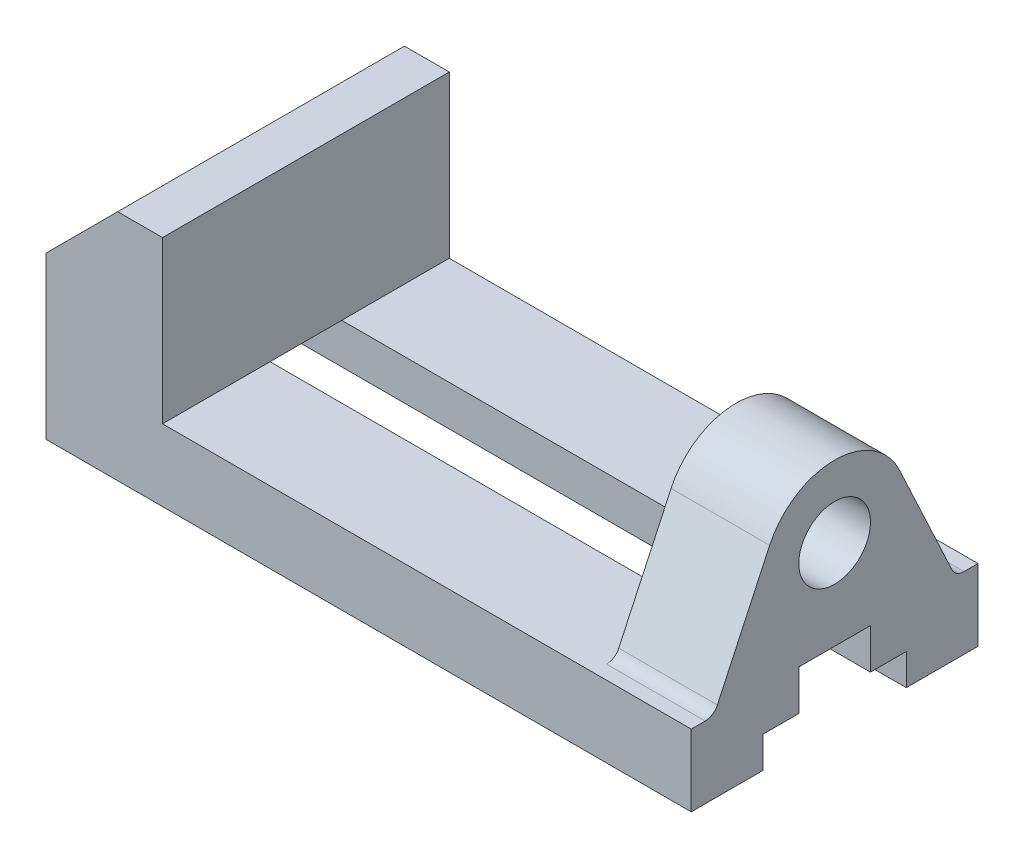
ISO-10303-21;
HEADER;
FILE_DESCRIPTION(('STEP AP214'),'2;1');
FILE_NAME('part.step','',(''),(''),'','','');
FILE_SCHEMA(('AUTOMOTIVE_DESIGN { 1 0 10303 214 1 1 1 1 }'));
ENDSEC;
DATA;
#1=APPLICATION_CONTEXT('core data for automotive mechanical design processes');
#2=APPLICATION_PROTOCOL_DEFINITION('international standard','automotive_design',2000,#1);
#3=PRODUCT_CONTEXT('',#1,'mechanical');
#4=PRODUCT('Part','Part','',(#3));
#5=PRODUCT_RELATED_PRODUCT_CATEGORY('part','',(#4));
#6=PRODUCT_DEFINITION_FORMATION('','',#4);
#7=PRODUCT_DEFINITION_CONTEXT('part definition',#1,'design');
#8=PRODUCT_DEFINITION('design','',#6,#7);
#9=PRODUCT_DEFINITION_SHAPE('','',#8);
#10=(LENGTH_UNIT() NAMED_UNIT(*) SI_UNIT(.MILLI.,.METRE.));
#11=(NAMED_UNIT(*) PLANE_ANGLE_UNIT() SI_UNIT($,.RADIAN.));
#12=(NAMED_UNIT(*) SI_UNIT($,.STERADIAN.) SOLID_ANGLE_UNIT());
#13=UNCERTAINTY_MEASURE_WITH_UNIT(LENGTH_MEASURE(1.E-05),#10,'distance_accuracy_value','');
#14=(GEOMETRIC_REPRESENTATION_CONTEXT(3) GLOBAL_UNCERTAINTY_ASSIGNED_CONTEXT((#13)) GLOBAL_UNIT_ASSIGNED_CONTEXT((#10,
#11,#12)) REPRESENTATION_CONTEXT('',''));
#15=CARTESIAN_POINT('',(0.,0.,0.));
#16=DIRECTION('',(0.,0.,1.));
#17=DIRECTION('',(1.,0.,0.));
#18=AXIS2_PLACEMENT_3D('',#15,#16,#17);
#19=CARTESIAN_POINT('',(26.,16.,32.));
#20=DIRECTION('',(0.,1.,0.));
#21=DIRECTION('',(0.,0.,1.));
#22=AXIS2_PLACEMENT_3D('',#19,#20,#21);
#23=PLANE('',#22);
#24=DIRECTION('',(1.,0.,0.));
#25=VECTOR('',#24,1.);
#26=CARTESIAN_POINT('',(0.,16.,8.));
#27=LINE('',#26,#25);
#28=CARTESIAN_POINT('',(26.,16.,8.));
#29=VERTEX_POINT('',#28);
#30=CARTESIAN_POINT('',(122.,16.,8.));
#31=VERTEX_POINT('',#30);
#32=EDGE_CURVE('E78',#29,#31,#27,.T.);
#33=ORIENTED_EDGE('',*,*,#32,.F.);
#34=DIRECTION('',(0.,0.,-1.));
#35=VECTOR('',#34,1.);
#36=CARTESIAN_POINT('',(26.,16.,32.));
#37=LINE('',#36,#35);
#38=CARTESIAN_POINT('',(26.,16.,32.));
#39=VERTEX_POINT('',#38);
#40=EDGE_CURVE('E444',#39,#29,#37,.T.);
#41=ORIENTED_EDGE('',*,*,#40,.F.);
#42=DIRECTION('',(1.,0.,0.));
#43=VECTOR('',#42,1.);
#44=CARTESIAN_POINT('',(26.,16.,32.));
#45=LINE('',#44,#43);
#46=CARTESIAN_POINT('',(144.,16.,32.));
#47=VERTEX_POINT('',#46);
#48=EDGE_CURVE('E407',#39,#47,#45,.T.);
#49=ORIENTED_EDGE('',*,*,#48,.T.);
#50=DIRECTION('',(0.,0.,-1.));
#51=VECTOR('',#50,1.);
#52=CARTESIAN_POINT('',(144.,16.,32.));
#53=LINE('',#52,#51);
#54=CARTESIAN_POINT('',(144.,16.,28.8914106489222));
#55=VERTEX_POINT('',#54);
#56=EDGE_CURVE('E438',#47,#55,#53,.T.);
#57=ORIENTED_EDGE('',*,*,#56,.T.);
#58=DIRECTION('',(1.,0.,0.));
#59=VECTOR('',#58,1.);
#60=CARTESIAN_POINT('',(26.,16.,28.8914106489222));
#61=LINE('',#60,#59);
#62=CARTESIAN_POINT('',(122.,16.,28.8914106489222));
#63=VERTEX_POINT('',#62);
#64=EDGE_CURVE('E474',#55,#63,#61,.F.);
#65=ORIENTED_EDGE('',*,*,#64,.T.);
#66=DIRECTION('',(0.,0.,1.));
#67=VECTOR('',#66,1.);
#68=CARTESIAN_POINT('',(122.,16.,-26.9801998664997));
#69=LINE('',#68,#67);
#70=EDGE_CURVE('E354',#31,#63,#69,.T.);
#71=ORIENTED_EDGE('',*,*,#70,.F.);
#72=EDGE_LOOP('',(#33,#41,#49,#57,#65,#71));
#73=FACE_BOUND('',#72,.T.);
#74=ADVANCED_FACE('F54',(#73),#23,.T.);
#75=CARTESIAN_POINT('',(144.,0.,32.));
#76=DIRECTION('',(0.,-1.,0.));
#77=DIRECTION('',(0.,0.,-1.));
#78=AXIS2_PLACEMENT_3D('',#75,#76,#77);
#79=PLANE('',#78);
#80=CARTESIAN_POINT('',(108.,0.,22.));
#81=DIRECTION('',(0.,-1.,0.));
#82=DIRECTION('',(0.,0.,-1.));
#83=AXIS2_PLACEMENT_3D('',#80,#81,#82);
#84=CIRCLE('',#83,3.);
#85=CARTESIAN_POINT('',(108.,0.,19.));
#86=VERTEX_POINT('',#85);
#87=EDGE_CURVE('E232',#86,#86,#84,.T.);
#88=ORIENTED_EDGE('',*,*,#87,.F.);
#89=EDGE_LOOP('',(#88));
#90=FACE_BOUND('',#89,.T.);
#91=CARTESIAN_POINT('',(38.,0.,22.));
#92=DIRECTION('',(0.,-1.,0.));
#93=DIRECTION('',(0.,0.,-1.));
#94=AXIS2_PLACEMENT_3D('',#91,#92,#93);
#95=CIRCLE('',#94,3.);
#96=CARTESIAN_POINT('',(38.,0.,19.));
#97=VERTEX_POINT('',#96);
#98=EDGE_CURVE('E245',#97,#97,#95,.T.);
#99=ORIENTED_EDGE('',*,*,#98,.F.);
#100=EDGE_LOOP('',(#99));
#101=FACE_BOUND('',#100,.T.);
#102=DIRECTION('',(-1.,0.,0.));
#103=VECTOR('',#102,1.);
#104=CARTESIAN_POINT('',(144.,0.,16.));
#105=LINE('',#104,#103);
#106=CARTESIAN_POINT('',(144.,0.,16.));
#107=VERTEX_POINT('',#106);
#108=CARTESIAN_POINT('',(0.,0.,16.));
#109=VERTEX_POINT('',#108);
#110=EDGE_CURVE('E12',#107,#109,#105,.T.);
#111=ORIENTED_EDGE('',*,*,#110,.F.);
#112=DIRECTION('',(0.,0.,-1.));
#113=VECTOR('',#112,1.);
#114=CARTESIAN_POINT('',(144.,0.,32.));
#115=LINE('',#114,#113);
#116=CARTESIAN_POINT('',(144.,0.,32.));
#117=VERTEX_POINT('',#116);
#118=EDGE_CURVE('E463',#117,#107,#115,.T.);
#119=ORIENTED_EDGE('',*,*,#118,.F.);
#120=DIRECTION('',(-1.,0.,0.));
#121=VECTOR('',#120,1.);
#122=CARTESIAN_POINT('',(144.,0.,32.));
#123=LINE('',#122,#121);
#124=CARTESIAN_POINT('',(0.,0.,32.));
#125=VERTEX_POINT('',#124);
#126=EDGE_CURVE('E386',#117,#125,#123,.T.);
#127=ORIENTED_EDGE('',*,*,#126,.T.);
#128=DIRECTION('',(0.,0.,-1.));
#129=VECTOR('',#128,1.);
#130=CARTESIAN_POINT('',(0.,0.,32.));
#131=LINE('',#130,#129);
#132=EDGE_CURVE('E458',#125,#109,#131,.T.);
#133=ORIENTED_EDGE('',*,*,#132,.T.);
#134=EDGE_LOOP('',(#111,#119,#127,#133));
#135=FACE_BOUND('',#134,.T.);
#136=ADVANCED_FACE('F562',(#90,#101,#135),#79,.T.);
#137=DIRECTION('',(1.,0.,0.));
#138=VECTOR('',#137,1.);
#139=CARTESIAN_POINT('',(0.,16.,-8.));
#140=LINE('',#139,#138);
#141=CARTESIAN_POINT('',(26.,16.,-8.));
#142=VERTEX_POINT('',#141);
#143=CARTESIAN_POINT('',(122.,16.,-8.));
#144=VERTEX_POINT('',#143);
#145=EDGE_CURVE('E329',#142,#144,#140,.T.);
#146=ORIENTED_EDGE('',*,*,#145,.T.);
#147=CARTESIAN_POINT('',(122.,16.,-28.8914106489222));
#148=VERTEX_POINT('',#147);
#149=EDGE_CURVE('E348',#148,#144,#69,.T.);
#150=ORIENTED_EDGE('',*,*,#149,.F.);
#151=DIRECTION('',(1.,0.,0.));
#152=VECTOR('',#151,1.);
#153=CARTESIAN_POINT('',(26.,16.,-28.8914106489222));
#154=LINE('',#153,#152);
#155=CARTESIAN_POINT('',(144.,16.,-28.8914106489222));
#156=VERTEX_POINT('',#155);
#157=EDGE_CURVE('E470',#148,#156,#154,.T.);
#158=ORIENTED_EDGE('',*,*,#157,.T.);
#159=CARTESIAN_POINT('',(144.,16.,-32.));
#160=VERTEX_POINT('',#159);
#161=EDGE_CURVE('E443',#156,#160,#53,.T.);
#162=ORIENTED_EDGE('',*,*,#161,.T.);
#163=DIRECTION('',(1.,0.,0.));
#164=VECTOR('',#163,1.);
#165=CARTESIAN_POINT('',(26.,16.,-32.));
#166=LINE('',#165,#164);
#167=CARTESIAN_POINT('',(26.,16.,-32.));
#168=VERTEX_POINT('',#167);
#169=EDGE_CURVE('E387',#168,#160,#166,.T.);
#170=ORIENTED_EDGE('',*,*,#169,.F.);
#171=EDGE_CURVE('E448',#142,#168,#37,.T.);
#172=ORIENTED_EDGE('',*,*,#171,.F.);
#173=EDGE_LOOP('',(#146,#150,#158,#162,#170,#172));
#174=FACE_BOUND('',#173,.T.);
#175=ADVANCED_FACE('F539',(#174),#23,.T.);
#176=CARTESIAN_POINT('',(144.,16.,32.));
#177=DIRECTION('',(1.,0.,0.));
#178=DIRECTION('',(0.,0.,-1.));
#179=AXIS2_PLACEMENT_3D('',#176,#177,#178);
#180=PLANE('',#179);
#181=DIRECTION('',(0.,-1.,0.));
#182=VECTOR('',#181,1.);
#183=CARTESIAN_POINT('',(144.,-4.42358875588411,16.));
#184=LINE('',#183,#182);
#185=CARTESIAN_POINT('',(144.,7.,16.));
#186=VERTEX_POINT('',#185);
#187=EDGE_CURVE('E265',#186,#107,#184,.T.);
#188=ORIENTED_EDGE('',*,*,#187,.F.);
#189=DIRECTION('',(0.,0.,1.));
#190=VECTOR('',#189,1.);
#191=CARTESIAN_POINT('',(144.,7.,16.));
#192=LINE('',#191,#190);
#193=CARTESIAN_POINT('',(144.,7.,8.));
#194=VERTEX_POINT('',#193);
#195=EDGE_CURVE('E308',#194,#186,#192,.T.);
#196=ORIENTED_EDGE('',*,*,#195,.F.);
#197=DIRECTION('',(0.,-1.,0.));
#198=VECTOR('',#197,1.);
#199=CARTESIAN_POINT('',(144.,7.,8.));
#200=LINE('',#199,#198);
#201=CARTESIAN_POINT('',(144.,16.,8.));
#202=VERTEX_POINT('',#201);
#203=EDGE_CURVE('E304',#202,#194,#200,.T.);
#204=ORIENTED_EDGE('',*,*,#203,.F.);
#205=DIRECTION('',(0.,0.,1.));
#206=VECTOR('',#205,1.);
#207=CARTESIAN_POINT('',(144.,16.,8.));
#208=LINE('',#207,#206);
#209=CARTESIAN_POINT('',(144.,16.,-8.));
#210=VERTEX_POINT('',#209);
#211=EDGE_CURVE('E300',#210,#202,#208,.T.);
#212=ORIENTED_EDGE('',*,*,#211,.F.);
#213=DIRECTION('',(0.,1.,0.));
#214=VECTOR('',#213,1.);
#215=CARTESIAN_POINT('',(144.,16.,-8.));
#216=LINE('',#215,#214);
#217=CARTESIAN_POINT('',(144.,7.,-8.));
#218=VERTEX_POINT('',#217);
#219=EDGE_CURVE('E296',#218,#210,#216,.T.);
#220=ORIENTED_EDGE('',*,*,#219,.F.);
#221=DIRECTION('',(0.,0.,1.));
#222=VECTOR('',#221,1.);
#223=CARTESIAN_POINT('',(144.,7.,-8.));
#224=LINE('',#223,#222);
#225=CARTESIAN_POINT('',(144.,7.,-16.));
#226=VERTEX_POINT('',#225);
#227=EDGE_CURVE('E292',#226,#218,#224,.T.);
#228=ORIENTED_EDGE('',*,*,#227,.F.);
#229=DIRECTION('',(0.,1.,0.));
#230=VECTOR('',#229,1.);
#231=CARTESIAN_POINT('',(144.,7.,-16.));
#232=LINE('',#231,#230);
#233=CARTESIAN_POINT('',(144.,0.,-16.));
#234=VERTEX_POINT('',#233);
#235=EDGE_CURVE('E261',#234,#226,#232,.T.);
#236=ORIENTED_EDGE('',*,*,#235,.F.);
#237=CARTESIAN_POINT('',(144.,0.,-32.));
#238=VERTEX_POINT('',#237);
#239=EDGE_CURVE('E411',#234,#238,#115,.T.);
#240=ORIENTED_EDGE('',*,*,#239,.T.);
#241=DIRECTION('',(0.,-1.,0.));
#242=VECTOR('',#241,1.);
#243=CARTESIAN_POINT('',(144.,16.,-32.));
#244=LINE('',#243,#242);
#245=EDGE_CURVE('E381',#160,#238,#244,.T.);
#246=ORIENTED_EDGE('',*,*,#245,.F.);
#247=ORIENTED_EDGE('',*,*,#161,.F.);
#248=CARTESIAN_POINT('',(144.,19.,-28.8914106489222));
#249=DIRECTION('',(1.,0.,0.));
#250=DIRECTION('',(0.,0.,-1.));
#251=AXIS2_PLACEMENT_3D('',#248,#249,#250);
#252=CIRCLE('',#251,3.);
#253=CARTESIAN_POINT('',(144.,17.7321452147779,-26.1724872878123));
#254=VERTEX_POINT('',#253);
#255=EDGE_CURVE('E487',#156,#254,#252,.F.);
#256=ORIENTED_EDGE('',*,*,#255,.T.);
#257=DIRECTION('',(0.,-0.906307787036651,-0.422618261740697));
#258=VECTOR('',#257,1.);
#259=CARTESIAN_POINT('',(144.,42.7618921878511,-14.5009245925864));
#260=LINE('',#259,#258);
#261=CARTESIAN_POINT('',(144.,42.7618921878511,-14.5009245925864));
#262=VERTEX_POINT('',#261);
#263=EDGE_CURVE('E370',#262,#254,#260,.T.);
#264=ORIENTED_EDGE('',*,*,#263,.F.);
#265=CARTESIAN_POINT('',(144.,36.,0.));
#266=DIRECTION('',(-1.,0.,0.));
#267=DIRECTION('',(0.,0.,1.));
#268=AXIS2_PLACEMENT_3D('',#265,#266,#267);
#269=CIRCLE('',#268,16.);
#270=CARTESIAN_POINT('',(144.,42.7618921878511,14.5009245925864));
#271=VERTEX_POINT('',#270);
#272=EDGE_CURVE('E367',#271,#262,#269,.T.);
#273=ORIENTED_EDGE('',*,*,#272,.F.);
#274=DIRECTION('',(0.,0.906307787036651,-0.422618261740697));
#275=VECTOR('',#274,1.);
#276=CARTESIAN_POINT('',(144.,16.,26.9801998664997));
#277=LINE('',#276,#275);
#278=CARTESIAN_POINT('',(144.,17.7321452147779,26.1724872878123));
#279=VERTEX_POINT('',#278);
#280=EDGE_CURVE('E344',#279,#271,#277,.T.);
#281=ORIENTED_EDGE('',*,*,#280,.F.);
#282=CARTESIAN_POINT('',(144.,19.,28.8914106489222));
#283=DIRECTION('',(1.,0.,0.));
#284=DIRECTION('',(0.,0.,-1.));
#285=AXIS2_PLACEMENT_3D('',#282,#283,#284);
#286=CIRCLE('',#285,3.);
#287=EDGE_CURVE('E481',#279,#55,#286,.F.);
#288=ORIENTED_EDGE('',*,*,#287,.T.);
#289=ORIENTED_EDGE('',*,*,#56,.F.);
#290=DIRECTION('',(0.,-1.,0.));
#291=VECTOR('',#290,1.);
#292=CARTESIAN_POINT('',(144.,16.,32.));
#293=LINE('',#292,#291);
#294=EDGE_CURVE('E382',#47,#117,#293,.T.);
#295=ORIENTED_EDGE('',*,*,#294,.T.);
#296=ORIENTED_EDGE('',*,*,#118,.T.);
#297=EDGE_LOOP('',(#188,#196,#204,#212,#220,#228,#236,#240,#246,#247,#256,#264,#273,#281,#288,
#289,#295,#296));
#298=FACE_BOUND('',#297,.T.);
#299=CARTESIAN_POINT('',(144.,36.,0.));
#300=DIRECTION('',(1.,0.,0.));
#301=DIRECTION('',(0.,0.,-1.));
#302=AXIS2_PLACEMENT_3D('',#299,#300,#301);
#303=CIRCLE('',#302,8.);
#304=CARTESIAN_POINT('',(144.,36.,-8.));
#305=VERTEX_POINT('',#304);
#306=EDGE_CURVE('E339',#305,#305,#303,.T.);
#307=ORIENTED_EDGE('',*,*,#306,.F.);
#308=EDGE_LOOP('',(#307));
#309=FACE_BOUND('',#308,.T.);
#310=ADVANCED_FACE('F502',(#298,#309),#180,.T.);
#311=CARTESIAN_POINT('',(26.,52.,32.));
#312=DIRECTION('',(1.,0.,0.));
#313=DIRECTION('',(0.,1.,0.));
#314=AXIS2_PLACEMENT_3D('',#311,#312,#313);
#315=PLANE('',#314);
#316=DIRECTION('',(0.,-1.,0.));
#317=VECTOR('',#316,1.);
#318=CARTESIAN_POINT('',(26.,52.,-32.));
#319=LINE('',#318,#317);
#320=CARTESIAN_POINT('',(26.,52.,-32.));
#321=VERTEX_POINT('',#320);
#322=EDGE_CURVE('E431',#321,#168,#319,.T.);
#323=ORIENTED_EDGE('',*,*,#322,.F.);
#324=DIRECTION('',(0.,0.,-1.));
#325=VECTOR('',#324,1.);
#326=CARTESIAN_POINT('',(26.,52.,32.));
#327=LINE('',#326,#325);
#328=CARTESIAN_POINT('',(26.,52.,32.));
#329=VERTEX_POINT('',#328);
#330=EDGE_CURVE('E449',#329,#321,#327,.T.);
#331=ORIENTED_EDGE('',*,*,#330,.F.);
#332=DIRECTION('',(0.,-1.,0.));
#333=VECTOR('',#332,1.);
#334=CARTESIAN_POINT('',(26.,52.,32.));
#335=LINE('',#334,#333);
#336=EDGE_CURVE('E403',#329,#39,#335,.T.);
#337=ORIENTED_EDGE('',*,*,#336,.T.);
#338=ORIENTED_EDGE('',*,*,#40,.T.);
#339=DIRECTION('',(0.,0.,1.));
#340=VECTOR('',#339,1.);
#341=CARTESIAN_POINT('',(26.,16.,32.));
#342=LINE('',#341,#340);
#343=EDGE_CURVE('E317',#142,#29,#342,.T.);
#344=ORIENTED_EDGE('',*,*,#343,.F.);
#345=ORIENTED_EDGE('',*,*,#171,.T.);
#346=EDGE_LOOP('',(#323,#331,#337,#338,#344,#345));
#347=FACE_BOUND('',#346,.T.);
#348=ADVANCED_FACE('F575',(#347),#315,.T.);
#349=CARTESIAN_POINT('',(16.,52.,32.));
#350=DIRECTION('',(0.,1.,0.));
#351=DIRECTION('',(0.,0.,1.));
#352=AXIS2_PLACEMENT_3D('',#349,#350,#351);
#353=PLANE('',#352);
#354=DIRECTION('',(1.,0.,0.));
#355=VECTOR('',#354,1.);
#356=CARTESIAN_POINT('',(16.,52.,-32.));
#357=LINE('',#356,#355);
#358=CARTESIAN_POINT('',(16.,52.,-32.));
#359=VERTEX_POINT('',#358);
#360=EDGE_CURVE('E427',#359,#321,#357,.T.);
#361=ORIENTED_EDGE('',*,*,#360,.F.);
#362=DIRECTION('',(0.,0.,-1.));
#363=VECTOR('',#362,1.);
#364=CARTESIAN_POINT('',(16.,52.,32.));
#365=LINE('',#364,#363);
#366=CARTESIAN_POINT('',(16.,52.,32.));
#367=VERTEX_POINT('',#366);
#368=EDGE_CURVE('E452',#367,#359,#365,.T.);
#369=ORIENTED_EDGE('',*,*,#368,.F.);
#370=DIRECTION('',(1.,0.,0.));
#371=VECTOR('',#370,1.);
#372=CARTESIAN_POINT('',(16.,52.,32.));
#373=LINE('',#372,#371);
#374=EDGE_CURVE('E399',#367,#329,#373,.T.);
#375=ORIENTED_EDGE('',*,*,#374,.T.);
#376=ORIENTED_EDGE('',*,*,#330,.T.);
#377=EDGE_LOOP('',(#361,#369,#375,#376));
#378=FACE_BOUND('',#377,.T.);
#379=ADVANCED_FACE('F580',(#378),#353,.T.);
#380=CARTESIAN_POINT('',(0.,36.,32.));
#381=DIRECTION('',(-0.707106781186548,0.707106781186547,0.));
#382=DIRECTION('',(-0.707106781186547,-0.707106781186548,0.));
#383=AXIS2_PLACEMENT_3D('',#380,#381,#382);
#384=PLANE('',#383);
#385=DIRECTION('',(0.707106781186548,0.707106781186548,0.));
#386=VECTOR('',#385,1.);
#387=CARTESIAN_POINT('',(0.,36.,-32.));
#388=LINE('',#387,#386);
#389=CARTESIAN_POINT('',(0.,36.,-32.));
#390=VERTEX_POINT('',#389);
#391=EDGE_CURVE('E423',#390,#359,#388,.T.);
#392=ORIENTED_EDGE('',*,*,#391,.F.);
#393=DIRECTION('',(0.,0.,-1.));
#394=VECTOR('',#393,1.);
#395=CARTESIAN_POINT('',(0.,36.,32.));
#396=LINE('',#395,#394);
#397=CARTESIAN_POINT('',(0.,36.,32.));
#398=VERTEX_POINT('',#397);
#399=EDGE_CURVE('E455',#398,#390,#396,.T.);
#400=ORIENTED_EDGE('',*,*,#399,.F.);
#401=DIRECTION('',(0.707106781186548,0.707106781186548,0.));
#402=VECTOR('',#401,1.);
#403=CARTESIAN_POINT('',(0.,36.,32.));
#404=LINE('',#403,#402);
#405=EDGE_CURVE('E395',#398,#367,#404,.T.);
#406=ORIENTED_EDGE('',*,*,#405,.T.);
#407=ORIENTED_EDGE('',*,*,#368,.T.);
#408=EDGE_LOOP('',(#392,#400,#406,#407));
#409=FACE_BOUND('',#408,.T.);
#410=ADVANCED_FACE('F637',(#409),#384,.T.);
#411=CARTESIAN_POINT('',(0.,0.,32.));
#412=DIRECTION('',(-1.,0.,0.));
#413=DIRECTION('',(0.,0.,1.));
#414=AXIS2_PLACEMENT_3D('',#411,#412,#413);
#415=PLANE('',#414);
#416=DIRECTION('',(0.,-1.,0.));
#417=VECTOR('',#416,1.);
#418=CARTESIAN_POINT('',(0.,-4.42358875588411,16.));
#419=LINE('',#418,#417);
#420=CARTESIAN_POINT('',(0.,7.,16.));
#421=VERTEX_POINT('',#420);
#422=EDGE_CURVE('E285',#421,#109,#419,.T.);
#423=ORIENTED_EDGE('',*,*,#422,.T.);
#424=ORIENTED_EDGE('',*,*,#132,.F.);
#425=DIRECTION('',(0.,1.,0.));
#426=VECTOR('',#425,1.);
#427=CARTESIAN_POINT('',(0.,0.,32.));
#428=LINE('',#427,#426);
#429=EDGE_CURVE('E391',#125,#398,#428,.T.);
#430=ORIENTED_EDGE('',*,*,#429,.T.);
#431=ORIENTED_EDGE('',*,*,#399,.T.);
#432=DIRECTION('',(0.,1.,0.));
#433=VECTOR('',#432,1.);
#434=CARTESIAN_POINT('',(0.,0.,-32.));
#435=LINE('',#434,#433);
#436=CARTESIAN_POINT('',(0.,0.,-32.));
#437=VERTEX_POINT('',#436);
#438=EDGE_CURVE('E419',#437,#390,#435,.T.);
#439=ORIENTED_EDGE('',*,*,#438,.F.);
#440=CARTESIAN_POINT('',(0.,0.,-16.));
#441=VERTEX_POINT('',#440);
#442=EDGE_CURVE('E462',#441,#437,#131,.T.);
#443=ORIENTED_EDGE('',*,*,#442,.F.);
#444=DIRECTION('',(0.,1.,0.));
#445=VECTOR('',#444,1.);
#446=CARTESIAN_POINT('',(0.,7.,-16.));
#447=LINE('',#446,#445);
#448=CARTESIAN_POINT('',(0.,7.,-16.));
#449=VERTEX_POINT('',#448);
#450=EDGE_CURVE('E70',#441,#449,#447,.T.);
#451=ORIENTED_EDGE('',*,*,#450,.T.);
#452=DIRECTION('',(0.,0.,1.));
#453=VECTOR('',#452,1.);
#454=CARTESIAN_POINT('',(0.,7.,-8.));
#455=LINE('',#454,#453);
#456=CARTESIAN_POINT('',(0.,7.,-8.));
#457=VERTEX_POINT('',#456);
#458=EDGE_CURVE('E264',#449,#457,#455,.T.);
#459=ORIENTED_EDGE('',*,*,#458,.T.);
#460=DIRECTION('',(0.,1.,0.));
#461=VECTOR('',#460,1.);
#462=CARTESIAN_POINT('',(0.,16.,-8.));
#463=LINE('',#462,#461);
#464=CARTESIAN_POINT('',(0.,16.,-8.));
#465=VERTEX_POINT('',#464);
#466=EDGE_CURVE('E269',#457,#465,#463,.T.);
#467=ORIENTED_EDGE('',*,*,#466,.T.);
#468=DIRECTION('',(0.,0.,1.));
#469=VECTOR('',#468,1.);
#470=CARTESIAN_POINT('',(0.,16.,8.));
#471=LINE('',#470,#469);
#472=CARTESIAN_POINT('',(0.,16.,8.));
#473=VERTEX_POINT('',#472);
#474=EDGE_CURVE('E273',#465,#473,#471,.T.);
#475=ORIENTED_EDGE('',*,*,#474,.T.);
#476=DIRECTION('',(0.,-1.,0.));
#477=VECTOR('',#476,1.);
#478=CARTESIAN_POINT('',(0.,7.,8.));
#479=LINE('',#478,#477);
#480=CARTESIAN_POINT('',(0.,7.,8.));
#481=VERTEX_POINT('',#480);
#482=EDGE_CURVE('E277',#473,#481,#479,.T.);
#483=ORIENTED_EDGE('',*,*,#482,.T.);
#484=DIRECTION('',(0.,0.,1.));
#485=VECTOR('',#484,1.);
#486=CARTESIAN_POINT('',(0.,7.,16.));
#487=LINE('',#486,#485);
#488=EDGE_CURVE('E281',#481,#421,#487,.T.);
#489=ORIENTED_EDGE('',*,*,#488,.T.);
#490=EDGE_LOOP('',(#423,#424,#430,#431,#439,#443,#451,#459,#467,#475,#483,#489));
#491=FACE_BOUND('',#490,.T.);
#492=ADVANCED_FACE('F548',(#491),#415,.T.);
#493=CARTESIAN_POINT('',(108.,0.,-22.));
#494=DIRECTION('',(0.,-1.,0.));
#495=DIRECTION('',(0.,0.,-1.));
#496=AXIS2_PLACEMENT_3D('',#493,#494,#495);
#497=CIRCLE('',#496,3.);
#498=CARTESIAN_POINT('',(108.,0.,-25.));
#499=VERTEX_POINT('',#498);
#500=EDGE_CURVE('E231',#499,#499,#497,.T.);
#501=ORIENTED_EDGE('',*,*,#500,.F.);
#502=EDGE_LOOP('',(#501));
#503=FACE_BOUND('',#502,.T.);
#504=CARTESIAN_POINT('',(38.,0.,-22.));
#505=DIRECTION('',(0.,-1.,0.));
#506=DIRECTION('',(0.,0.,-1.));
#507=AXIS2_PLACEMENT_3D('',#504,#505,#506);
#508=CIRCLE('',#507,3.);
#509=CARTESIAN_POINT('',(38.,0.,-25.));
#510=VERTEX_POINT('',#509);
#511=EDGE_CURVE('E253',#510,#510,#508,.T.);
#512=ORIENTED_EDGE('',*,*,#511,.F.);
#513=EDGE_LOOP('',(#512));
#514=FACE_BOUND('',#513,.T.);
#515=DIRECTION('',(1.,0.,0.));
#516=VECTOR('',#515,1.);
#517=CARTESIAN_POINT('',(144.,0.,-16.));
#518=LINE('',#517,#516);
#519=EDGE_CURVE('E63',#441,#234,#518,.T.);
#520=ORIENTED_EDGE('',*,*,#519,.F.);
#521=ORIENTED_EDGE('',*,*,#442,.T.);
#522=DIRECTION('',(-1.,0.,0.));
#523=VECTOR('',#522,1.);
#524=CARTESIAN_POINT('',(144.,0.,-32.));
#525=LINE('',#524,#523);
#526=EDGE_CURVE('E415',#238,#437,#525,.T.);
#527=ORIENTED_EDGE('',*,*,#526,.F.);
#528=ORIENTED_EDGE('',*,*,#239,.F.);
#529=EDGE_LOOP('',(#520,#521,#527,#528));
#530=FACE_BOUND('',#529,.T.);
#531=ADVANCED_FACE('F507',(#503,#514,#530),#79,.T.);
#532=CARTESIAN_POINT('',(0.,0.,32.));
#533=DIRECTION('',(0.,0.,-1.));
#534=DIRECTION('',(-1.,0.,0.));
#535=AXIS2_PLACEMENT_3D('',#532,#533,#534);
#536=PLANE('',#535);
#537=ORIENTED_EDGE('',*,*,#294,.F.);
#538=ORIENTED_EDGE('',*,*,#48,.F.);
#539=ORIENTED_EDGE('',*,*,#336,.F.);
#540=ORIENTED_EDGE('',*,*,#374,.F.);
#541=ORIENTED_EDGE('',*,*,#405,.F.);
#542=ORIENTED_EDGE('',*,*,#429,.F.);
#543=ORIENTED_EDGE('',*,*,#126,.F.);
#544=EDGE_LOOP('',(#537,#538,#539,#540,#541,#542,#543));
#545=FACE_BOUND('',#544,.T.);
#546=ADVANCED_FACE('F623',(#545),#536,.F.);
#547=CARTESIAN_POINT('',(0.,0.,-32.));
#548=DIRECTION('',(0.,0.,-1.));
#549=DIRECTION('',(-1.,0.,0.));
#550=AXIS2_PLACEMENT_3D('',#547,#548,#549);
#551=PLANE('',#550);
#552=ORIENTED_EDGE('',*,*,#245,.T.);
#553=ORIENTED_EDGE('',*,*,#526,.T.);
#554=ORIENTED_EDGE('',*,*,#438,.T.);
#555=ORIENTED_EDGE('',*,*,#391,.T.);
#556=ORIENTED_EDGE('',*,*,#360,.T.);
#557=ORIENTED_EDGE('',*,*,#322,.T.);
#558=ORIENTED_EDGE('',*,*,#169,.T.);
#559=EDGE_LOOP('',(#552,#553,#554,#555,#556,#557,#558));
#560=FACE_BOUND('',#559,.T.);
#561=ADVANCED_FACE('F622',(#560),#551,.T.);
#562=CARTESIAN_POINT('',(122.,16.,26.9801998664997));
#563=DIRECTION('',(0.,-0.422618261740697,-0.906307787036651));
#564=DIRECTION('',(0.,0.906307787036651,-0.422618261740697));
#565=AXIS2_PLACEMENT_3D('',#562,#563,#564);
#566=PLANE('',#565);
#567=DIRECTION('',(0.,0.906307787036651,-0.422618261740697));
#568=VECTOR('',#567,1.);
#569=CARTESIAN_POINT('',(122.,16.,26.9801998664997));
#570=LINE('',#569,#568);
#571=CARTESIAN_POINT('',(122.,17.7321452147779,26.1724872878123));
#572=VERTEX_POINT('',#571);
#573=CARTESIAN_POINT('',(122.,42.7618921878511,14.5009245925864));
#574=VERTEX_POINT('',#573);
#575=EDGE_CURVE('E352',#572,#574,#570,.T.);
#576=ORIENTED_EDGE('',*,*,#575,.F.);
#577=DIRECTION('',(1.,0.,0.));
#578=VECTOR('',#577,1.);
#579=CARTESIAN_POINT('',(122.,17.7321452147779,26.1724872878123));
#580=LINE('',#579,#578);
#581=EDGE_CURVE('E442',#572,#279,#580,.T.);
#582=ORIENTED_EDGE('',*,*,#581,.T.);
#583=ORIENTED_EDGE('',*,*,#280,.T.);
#584=DIRECTION('',(1.,0.,0.));
#585=VECTOR('',#584,1.);
#586=CARTESIAN_POINT('',(122.,42.7618921878511,14.5009245925864));
#587=LINE('',#586,#585);
#588=EDGE_CURVE('E377',#574,#271,#587,.T.);
#589=ORIENTED_EDGE('',*,*,#588,.F.);
#590=EDGE_LOOP('',(#576,#582,#583,#589));
#591=FACE_BOUND('',#590,.T.);
#592=ADVANCED_FACE('F598',(#591),#566,.F.);
#593=CARTESIAN_POINT('',(122.,36.,0.));
#594=DIRECTION('',(1.,0.,0.));
#595=DIRECTION('',(0.,0.,-1.));
#596=AXIS2_PLACEMENT_3D('',#593,#594,#595);
#597=CYLINDRICAL_SURFACE('',#596,16.);
#598=ORIENTED_EDGE('',*,*,#272,.T.);
#599=DIRECTION('',(1.,0.,0.));
#600=VECTOR('',#599,1.);
#601=CARTESIAN_POINT('',(122.,42.7618921878511,-14.5009245925864));
#602=LINE('',#601,#600);
#603=CARTESIAN_POINT('',(122.,42.7618921878511,-14.5009245925864));
#604=VERTEX_POINT('',#603);
#605=EDGE_CURVE('E364',#604,#262,#602,.T.);
#606=ORIENTED_EDGE('',*,*,#605,.F.);
#607=CARTESIAN_POINT('',(122.,36.,0.));
#608=DIRECTION('',(-1.,0.,0.));
#609=DIRECTION('',(0.,0.,1.));
#610=AXIS2_PLACEMENT_3D('',#607,#608,#609);
#611=CIRCLE('',#610,16.);
#612=EDGE_CURVE('E357',#574,#604,#611,.T.);
#613=ORIENTED_EDGE('',*,*,#612,.F.);
#614=ORIENTED_EDGE('',*,*,#588,.T.);
#615=EDGE_LOOP('',(#598,#606,#613,#614));
#616=FACE_BOUND('',#615,.T.);
#617=ADVANCED_FACE('F604',(#616),#597,.T.);
#618=CARTESIAN_POINT('',(122.,42.7618921878511,-14.5009245925864));
#619=DIRECTION('',(0.,-0.422618261740697,0.906307787036651));
#620=DIRECTION('',(0.,-0.906307787036651,-0.422618261740697));
#621=AXIS2_PLACEMENT_3D('',#618,#619,#620);
#622=PLANE('',#621);
#623=ORIENTED_EDGE('',*,*,#263,.T.);
#624=DIRECTION('',(1.,0.,0.));
#625=VECTOR('',#624,1.);
#626=CARTESIAN_POINT('',(122.,17.7321452147779,-26.1724872878123));
#627=LINE('',#626,#625);
#628=CARTESIAN_POINT('',(122.,17.7321452147779,-26.1724872878123));
#629=VERTEX_POINT('',#628);
#630=EDGE_CURVE('E478',#254,#629,#627,.F.);
#631=ORIENTED_EDGE('',*,*,#630,.T.);
#632=DIRECTION('',(0.,-0.906307787036651,-0.422618261740697));
#633=VECTOR('',#632,1.);
#634=CARTESIAN_POINT('',(122.,42.7618921878511,-14.5009245925864));
#635=LINE('',#634,#633);
#636=EDGE_CURVE('E360',#604,#629,#635,.T.);
#637=ORIENTED_EDGE('',*,*,#636,.F.);
#638=ORIENTED_EDGE('',*,*,#605,.T.);
#639=EDGE_LOOP('',(#623,#631,#637,#638));
#640=FACE_BOUND('',#639,.T.);
#641=ADVANCED_FACE('F609',(#640),#622,.F.);
#642=CARTESIAN_POINT('',(122.,36.,0.));
#643=DIRECTION('',(-1.,0.,0.));
#644=DIRECTION('',(0.,0.,1.));
#645=AXIS2_PLACEMENT_3D('',#642,#643,#644);
#646=PLANE('',#645);
#647=CARTESIAN_POINT('',(122.,36.,0.));
#648=DIRECTION('',(1.,0.,0.));
#649=DIRECTION('',(0.,0.,-1.));
#650=AXIS2_PLACEMENT_3D('',#647,#648,#649);
#651=CIRCLE('',#650,8.);
#652=CARTESIAN_POINT('',(122.,36.,-8.));
#653=VERTEX_POINT('',#652);
#654=EDGE_CURVE('E340',#653,#653,#651,.T.);
#655=ORIENTED_EDGE('',*,*,#654,.T.);
#656=EDGE_LOOP('',(#655));
#657=FACE_BOUND('',#656,.T.);
#658=ORIENTED_EDGE('',*,*,#149,.T.);
#659=EDGE_CURVE('E353',#144,#31,#69,.T.);
#660=ORIENTED_EDGE('',*,*,#659,.T.);
#661=ORIENTED_EDGE('',*,*,#70,.T.);
#662=CARTESIAN_POINT('',(122.,19.,28.8914106489222));
#663=DIRECTION('',(-1.,0.,0.));
#664=DIRECTION('',(0.,0.,1.));
#665=AXIS2_PLACEMENT_3D('',#662,#663,#664);
#666=CIRCLE('',#665,3.);
#667=EDGE_CURVE('E484',#63,#572,#666,.F.);
#668=ORIENTED_EDGE('',*,*,#667,.T.);
#669=ORIENTED_EDGE('',*,*,#575,.T.);
#670=ORIENTED_EDGE('',*,*,#612,.T.);
#671=ORIENTED_EDGE('',*,*,#636,.T.);
#672=CARTESIAN_POINT('',(122.,19.,-28.8914106489222));
#673=DIRECTION('',(-1.,0.,0.));
#674=DIRECTION('',(0.,0.,1.));
#675=AXIS2_PLACEMENT_3D('',#672,#673,#674);
#676=CIRCLE('',#675,3.);
#677=EDGE_CURVE('E490',#629,#148,#676,.F.);
#678=ORIENTED_EDGE('',*,*,#677,.T.);
#679=EDGE_LOOP('',(#658,#660,#661,#668,#669,#670,#671,#678));
#680=FACE_BOUND('',#679,.T.);
#681=ADVANCED_FACE('F535',(#657,#680),#646,.T.);
#682=CARTESIAN_POINT('',(122.,36.,0.));
#683=DIRECTION('',(1.,0.,0.));
#684=DIRECTION('',(0.,0.,-1.));
#685=AXIS2_PLACEMENT_3D('',#682,#683,#684);
#686=CYLINDRICAL_SURFACE('',#685,8.);
#687=ORIENTED_EDGE('',*,*,#654,.F.);
#688=EDGE_LOOP('',(#687));
#689=FACE_BOUND('',#688,.T.);
#690=ORIENTED_EDGE('',*,*,#306,.T.);
#691=EDGE_LOOP('',(#690));
#692=FACE_BOUND('',#691,.T.);
#693=ADVANCED_FACE('F585',(#689,#692),#686,.F.);
#694=CARTESIAN_POINT('',(122.,19.,28.8914106489222));
#695=DIRECTION('',(1.,0.,0.));
#696=DIRECTION('',(0.,0.,-1.));
#697=AXIS2_PLACEMENT_3D('',#694,#695,#696);
#698=CYLINDRICAL_SURFACE('',#697,3.);
#699=ORIENTED_EDGE('',*,*,#667,.F.);
#700=ORIENTED_EDGE('',*,*,#64,.F.);
#701=ORIENTED_EDGE('',*,*,#287,.F.);
#702=ORIENTED_EDGE('',*,*,#581,.F.);
#703=EDGE_LOOP('',(#699,#700,#701,#702));
#704=FACE_BOUND('',#703,.T.);
#705=ADVANCED_FACE('F583',(#704),#698,.F.);
#706=CARTESIAN_POINT('',(26.,19.,-28.8914106489222));
#707=DIRECTION('',(1.,0.,0.));
#708=DIRECTION('',(0.,0.,-1.));
#709=AXIS2_PLACEMENT_3D('',#706,#707,#708);
#710=CYLINDRICAL_SURFACE('',#709,3.);
#711=ORIENTED_EDGE('',*,*,#677,.F.);
#712=ORIENTED_EDGE('',*,*,#630,.F.);
#713=ORIENTED_EDGE('',*,*,#255,.F.);
#714=ORIENTED_EDGE('',*,*,#157,.F.);
#715=EDGE_LOOP('',(#711,#712,#713,#714));
#716=FACE_BOUND('',#715,.T.);
#717=ADVANCED_FACE('F56',(#716),#710,.F.);
#718=CARTESIAN_POINT('',(0.,16.,8.));
#719=DIRECTION('',(0.,1.,0.));
#720=DIRECTION('',(0.,0.,1.));
#721=AXIS2_PLACEMENT_3D('',#718,#719,#720);
#722=PLANE('',#721);
#723=ORIENTED_EDGE('',*,*,#343,.T.);
#724=EDGE_CURVE('E321',#473,#29,#27,.T.);
#725=ORIENTED_EDGE('',*,*,#724,.F.);
#726=ORIENTED_EDGE('',*,*,#474,.F.);
#727=EDGE_CURVE('E325',#465,#142,#140,.T.);
#728=ORIENTED_EDGE('',*,*,#727,.T.);
#729=EDGE_LOOP('',(#723,#725,#726,#728));
#730=FACE_BOUND('',#729,.T.);
#731=ADVANCED_FACE('F546',(#730),#722,.F.);
#732=CARTESIAN_POINT('',(0.,-4.42358875588411,16.));
#733=DIRECTION('',(0.,0.,1.));
#734=DIRECTION('',(1.,0.,0.));
#735=AXIS2_PLACEMENT_3D('',#732,#733,#734);
#736=PLANE('',#735);
#737=ORIENTED_EDGE('',*,*,#110,.T.);
#738=ORIENTED_EDGE('',*,*,#422,.F.);
#739=DIRECTION('',(1.,0.,0.));
#740=VECTOR('',#739,1.);
#741=CARTESIAN_POINT('',(0.,7.,16.));
#742=LINE('',#741,#740);
#743=EDGE_CURVE('E314',#421,#186,#742,.T.);
#744=ORIENTED_EDGE('',*,*,#743,.T.);
#745=ORIENTED_EDGE('',*,*,#187,.T.);
#746=EDGE_LOOP('',(#737,#738,#744,#745));
#747=FACE_BOUND('',#746,.T.);
#748=ADVANCED_FACE('F650',(#747),#736,.F.);
#749=CARTESIAN_POINT('',(0.,7.,16.));
#750=DIRECTION('',(0.,1.,0.));
#751=DIRECTION('',(0.,0.,1.));
#752=AXIS2_PLACEMENT_3D('',#749,#750,#751);
#753=PLANE('',#752);
#754=ORIENTED_EDGE('',*,*,#195,.T.);
#755=ORIENTED_EDGE('',*,*,#743,.F.);
#756=ORIENTED_EDGE('',*,*,#488,.F.);
#757=DIRECTION('',(1.,0.,0.));
#758=VECTOR('',#757,1.);
#759=CARTESIAN_POINT('',(0.,7.,8.));
#760=LINE('',#759,#758);
#761=EDGE_CURVE('E318',#481,#194,#760,.T.);
#762=ORIENTED_EDGE('',*,*,#761,.T.);
#763=EDGE_LOOP('',(#754,#755,#756,#762));
#764=FACE_BOUND('',#763,.T.);
#765=ADVANCED_FACE('F652',(#764),#753,.F.);
#766=CARTESIAN_POINT('',(0.,7.,8.));
#767=DIRECTION('',(0.,0.,1.));
#768=DIRECTION('',(0.,-1.,0.));
#769=AXIS2_PLACEMENT_3D('',#766,#767,#768);
#770=PLANE('',#769);
#771=ORIENTED_EDGE('',*,*,#203,.T.);
#772=ORIENTED_EDGE('',*,*,#761,.F.);
#773=ORIENTED_EDGE('',*,*,#482,.F.);
#774=ORIENTED_EDGE('',*,*,#724,.T.);
#775=ORIENTED_EDGE('',*,*,#32,.T.);
#776=EDGE_CURVE('E324',#31,#202,#27,.T.);
#777=ORIENTED_EDGE('',*,*,#776,.T.);
#778=EDGE_LOOP('',(#771,#772,#773,#774,#775,#777));
#779=FACE_BOUND('',#778,.T.);
#780=ADVANCED_FACE('F527',(#779),#770,.F.);
#781=ORIENTED_EDGE('',*,*,#659,.F.);
#782=EDGE_CURVE('E330',#144,#210,#140,.T.);
#783=ORIENTED_EDGE('',*,*,#782,.T.);
#784=ORIENTED_EDGE('',*,*,#211,.T.);
#785=ORIENTED_EDGE('',*,*,#776,.F.);
#786=EDGE_LOOP('',(#781,#783,#784,#785));
#787=FACE_BOUND('',#786,.T.);
#788=ADVANCED_FACE('F520',(#787),#722,.F.);
#789=CARTESIAN_POINT('',(0.,16.,-8.));
#790=DIRECTION('',(0.,0.,-1.));
#791=DIRECTION('',(0.,1.,0.));
#792=AXIS2_PLACEMENT_3D('',#789,#790,#791);
#793=PLANE('',#792);
#794=ORIENTED_EDGE('',*,*,#219,.T.);
#795=ORIENTED_EDGE('',*,*,#782,.F.);
#796=ORIENTED_EDGE('',*,*,#145,.F.);
#797=ORIENTED_EDGE('',*,*,#727,.F.);
#798=ORIENTED_EDGE('',*,*,#466,.F.);
#799=DIRECTION('',(1.,0.,0.));
#800=VECTOR('',#799,1.);
#801=CARTESIAN_POINT('',(0.,7.,-8.));
#802=LINE('',#801,#800);
#803=EDGE_CURVE('E331',#457,#218,#802,.T.);
#804=ORIENTED_EDGE('',*,*,#803,.T.);
#805=EDGE_LOOP('',(#794,#795,#796,#797,#798,#804));
#806=FACE_BOUND('',#805,.T.);
#807=ADVANCED_FACE('F524',(#806),#793,.F.);
#808=CARTESIAN_POINT('',(0.,7.,-8.));
#809=DIRECTION('',(0.,1.,0.));
#810=DIRECTION('',(0.,0.,1.));
#811=AXIS2_PLACEMENT_3D('',#808,#809,#810);
#812=PLANE('',#811);
#813=ORIENTED_EDGE('',*,*,#227,.T.);
#814=ORIENTED_EDGE('',*,*,#803,.F.);
#815=ORIENTED_EDGE('',*,*,#458,.F.);
#816=DIRECTION('',(1.,0.,0.));
#817=VECTOR('',#816,1.);
#818=CARTESIAN_POINT('',(0.,7.,-16.));
#819=LINE('',#818,#817);
#820=EDGE_CURVE('E289',#449,#226,#819,.T.);
#821=ORIENTED_EDGE('',*,*,#820,.T.);
#822=EDGE_LOOP('',(#813,#814,#815,#821));
#823=FACE_BOUND('',#822,.T.);
#824=ADVANCED_FACE('F551',(#823),#812,.F.);
#825=CARTESIAN_POINT('',(0.,7.,-16.));
#826=DIRECTION('',(0.,0.,-1.));
#827=DIRECTION('',(-1.,0.,0.));
#828=AXIS2_PLACEMENT_3D('',#825,#826,#827);
#829=PLANE('',#828);
#830=ORIENTED_EDGE('',*,*,#519,.T.);
#831=ORIENTED_EDGE('',*,*,#235,.T.);
#832=ORIENTED_EDGE('',*,*,#820,.F.);
#833=ORIENTED_EDGE('',*,*,#450,.F.);
#834=EDGE_LOOP('',(#830,#831,#832,#833));
#835=FACE_BOUND('',#834,.T.);
#836=ADVANCED_FACE('F495',(#835),#829,.F.);
#837=CARTESIAN_POINT('',(38.,10.,-22.));
#838=DIRECTION('',(0.,-1.,0.));
#839=DIRECTION('',(0.,0.,-1.));
#840=AXIS2_PLACEMENT_3D('',#837,#838,#839);
#841=CONICAL_SURFACE('',#840,3.,1.0471975511966);
#842=CARTESIAN_POINT('',(38.,11.7320508075689,-22.));
#843=VERTEX_POINT('',#842);
#844=VERTEX_LOOP('',#843);
#845=FACE_BOUND('',#844,.T.);
#846=CARTESIAN_POINT('',(38.,10.,-22.));
#847=DIRECTION('',(0.,-1.,0.));
#848=DIRECTION('',(0.,0.,-1.));
#849=AXIS2_PLACEMENT_3D('',#846,#847,#848);
#850=CIRCLE('',#849,3.);
#851=CARTESIAN_POINT('',(38.,10.,-25.));
#852=VERTEX_POINT('',#851);
#853=EDGE_CURVE('E257',#852,#852,#850,.T.);
#854=ORIENTED_EDGE('',*,*,#853,.T.);
#855=EDGE_LOOP('',(#854));
#856=FACE_BOUND('',#855,.T.);
#857=ADVANCED_FACE('F558',(#845,#856),#841,.F.);
#858=CARTESIAN_POINT('',(38.,0.,-22.));
#859=DIRECTION('',(0.,-1.,0.));
#860=DIRECTION('',(0.,0.,-1.));
#861=AXIS2_PLACEMENT_3D('',#858,#859,#860);
#862=CYLINDRICAL_SURFACE('',#861,3.);
#863=ORIENTED_EDGE('',*,*,#853,.F.);
#864=EDGE_LOOP('',(#863));
#865=FACE_BOUND('',#864,.T.);
#866=ORIENTED_EDGE('',*,*,#511,.T.);
#867=EDGE_LOOP('',(#866));
#868=FACE_BOUND('',#867,.T.);
#869=ADVANCED_FACE('F715',(#865,#868),#862,.F.);
#870=CARTESIAN_POINT('',(38.,10.,22.));
#871=DIRECTION('',(0.,-1.,0.));
#872=DIRECTION('',(0.,0.,-1.));
#873=AXIS2_PLACEMENT_3D('',#870,#871,#872);
#874=CONICAL_SURFACE('',#873,3.,1.0471975511966);
#875=CARTESIAN_POINT('',(38.,11.7320508075689,22.));
#876=VERTEX_POINT('',#875);
#877=VERTEX_LOOP('',#876);
#878=FACE_BOUND('',#877,.T.);
#879=CARTESIAN_POINT('',(38.,10.,22.));
#880=DIRECTION('',(0.,-1.,0.));
#881=DIRECTION('',(0.,0.,-1.));
#882=AXIS2_PLACEMENT_3D('',#879,#880,#881);
#883=CIRCLE('',#882,3.);
#884=CARTESIAN_POINT('',(38.,10.,19.));
#885=VERTEX_POINT('',#884);
#886=EDGE_CURVE('E249',#885,#885,#883,.T.);
#887=ORIENTED_EDGE('',*,*,#886,.T.);
#888=EDGE_LOOP('',(#887));
#889=FACE_BOUND('',#888,.T.);
#890=ADVANCED_FACE('F724',(#878,#889),#874,.F.);
#891=CARTESIAN_POINT('',(38.,0.,22.));
#892=DIRECTION('',(0.,-1.,0.));
#893=DIRECTION('',(0.,0.,-1.));
#894=AXIS2_PLACEMENT_3D('',#891,#892,#893);
#895=CYLINDRICAL_SURFACE('',#894,3.);
#896=ORIENTED_EDGE('',*,*,#886,.F.);
#897=EDGE_LOOP('',(#896));
#898=FACE_BOUND('',#897,.T.);
#899=ORIENTED_EDGE('',*,*,#98,.T.);
#900=EDGE_LOOP('',(#899));
#901=FACE_BOUND('',#900,.T.);
#902=ADVANCED_FACE('F753',(#898,#901),#895,.F.);
#903=CARTESIAN_POINT('',(108.,10.,-22.));
#904=DIRECTION('',(0.,-1.,0.));
#905=DIRECTION('',(0.,0.,-1.));
#906=AXIS2_PLACEMENT_3D('',#903,#904,#905);
#907=CONICAL_SURFACE('',#906,3.,1.0471975511966);
#908=CARTESIAN_POINT('',(108.,11.7320508075689,-22.));
#909=VERTEX_POINT('',#908);
#910=VERTEX_LOOP('',#909);
#911=FACE_BOUND('',#910,.T.);
#912=CARTESIAN_POINT('',(108.,10.,-22.));
#913=DIRECTION('',(0.,-1.,0.));
#914=DIRECTION('',(0.,0.,-1.));
#915=AXIS2_PLACEMENT_3D('',#912,#913,#914);
#916=CIRCLE('',#915,3.);
#917=CARTESIAN_POINT('',(108.,10.,-25.));
#918=VERTEX_POINT('',#917);
#919=EDGE_CURVE('E237',#918,#918,#916,.T.);
#920=ORIENTED_EDGE('',*,*,#919,.T.);
#921=EDGE_LOOP('',(#920));
#922=FACE_BOUND('',#921,.T.);
#923=ADVANCED_FACE('F763',(#911,#922),#907,.F.);
#924=CARTESIAN_POINT('',(108.,0.,-22.));
#925=DIRECTION('',(0.,-1.,0.));
#926=DIRECTION('',(0.,0.,-1.));
#927=AXIS2_PLACEMENT_3D('',#924,#925,#926);
#928=CYLINDRICAL_SURFACE('',#927,3.);
#929=ORIENTED_EDGE('',*,*,#919,.F.);
#930=EDGE_LOOP('',(#929));
#931=FACE_BOUND('',#930,.T.);
#932=ORIENTED_EDGE('',*,*,#500,.T.);
#933=EDGE_LOOP('',(#932));
#934=FACE_BOUND('',#933,.T.);
#935=ADVANCED_FACE('F224',(#931,#934),#928,.F.);
#936=CARTESIAN_POINT('',(108.,10.,22.));
#937=DIRECTION('',(0.,-1.,0.));
#938=DIRECTION('',(0.,0.,-1.));
#939=AXIS2_PLACEMENT_3D('',#936,#937,#938);
#940=CONICAL_SURFACE('',#939,3.,1.0471975511966);
#941=CARTESIAN_POINT('',(108.,11.7320508075689,22.));
#942=VERTEX_POINT('',#941);
#943=VERTEX_LOOP('',#942);
#944=FACE_BOUND('',#943,.T.);
#945=CARTESIAN_POINT('',(108.,10.,22.));
#946=DIRECTION('',(0.,-1.,0.));
#947=DIRECTION('',(0.,0.,-1.));
#948=AXIS2_PLACEMENT_3D('',#945,#946,#947);
#949=CIRCLE('',#948,3.);
#950=CARTESIAN_POINT('',(108.,10.,19.));
#951=VERTEX_POINT('',#950);
#952=EDGE_CURVE('E228',#951,#951,#949,.T.);
#953=ORIENTED_EDGE('',*,*,#952,.T.);
#954=EDGE_LOOP('',(#953));
#955=FACE_BOUND('',#954,.T.);
#956=ADVANCED_FACE('F220',(#944,#955),#940,.F.);
#957=CARTESIAN_POINT('',(108.,0.,22.));
#958=DIRECTION('',(0.,-1.,0.));
#959=DIRECTION('',(0.,0.,-1.));
#960=AXIS2_PLACEMENT_3D('',#957,#958,#959);
#961=CYLINDRICAL_SURFACE('',#960,3.);
#962=ORIENTED_EDGE('',*,*,#952,.F.);
#963=EDGE_LOOP('',(#962));
#964=FACE_BOUND('',#963,.T.);
#965=ORIENTED_EDGE('',*,*,#87,.T.);
#966=EDGE_LOOP('',(#965));
#967=FACE_BOUND('',#966,.T.);
#968=ADVANCED_FACE('F223',(#964,#967),#961,.F.);
#969=CLOSED_SHELL('',(#74,#136,#175,#310,#348,#379,#410,#492,#531,#546,#561,#592,#617,#641,#681,
#693,#705,#717,#731,#748,#765,#780,#788,#807,#824,#836,#857,#869,#890,#902,#923,#935,#956,#968));
#970=MANIFOLD_SOLID_BREP('B2',#969);
#971=ADVANCED_BREP_SHAPE_REPRESENTATION('',(#18,#970),#14);
#972=SHAPE_DEFINITION_REPRESENTATION(#9,#971);
ENDSEC;
END-ISO-10303-21;
